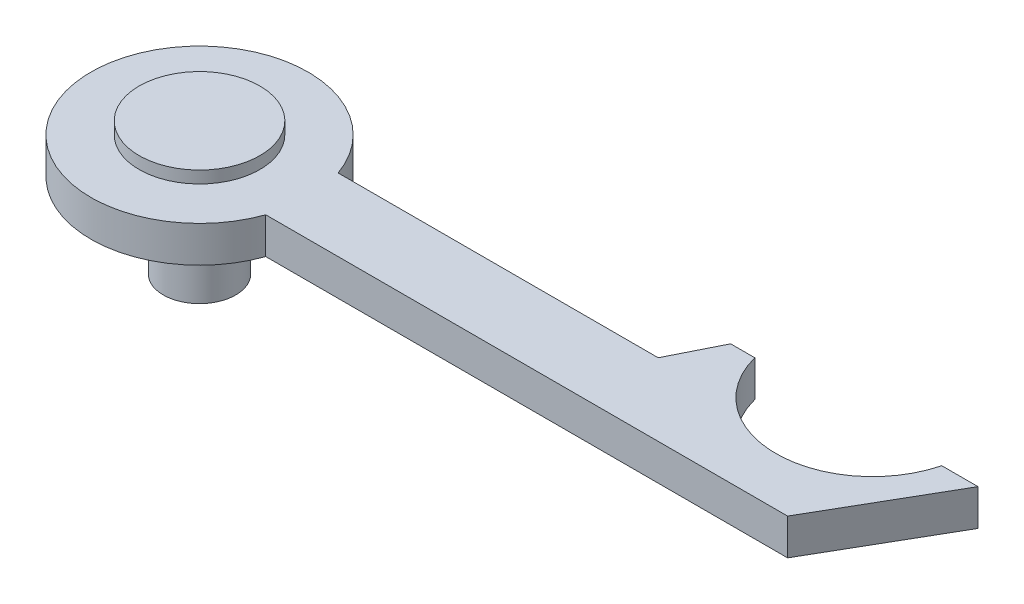
ISO-10303-21;
HEADER;
FILE_DESCRIPTION(('STEP AP214'),'2;1');
FILE_NAME('part.step','',(''),(''),'','','');
FILE_SCHEMA(('AUTOMOTIVE_DESIGN { 1 0 10303 214 1 1 1 1 }'));
ENDSEC;
DATA;
#1=APPLICATION_CONTEXT('core data for automotive mechanical design processes');
#2=APPLICATION_PROTOCOL_DEFINITION('international standard','automotive_design',2000,#1);
#3=PRODUCT_CONTEXT('',#1,'mechanical');
#4=PRODUCT('Part','Part','',(#3));
#5=PRODUCT_RELATED_PRODUCT_CATEGORY('part','',(#4));
#6=PRODUCT_DEFINITION_FORMATION('','',#4);
#7=PRODUCT_DEFINITION_CONTEXT('part definition',#1,'design');
#8=PRODUCT_DEFINITION('design','',#6,#7);
#9=PRODUCT_DEFINITION_SHAPE('','',#8);
#10=(LENGTH_UNIT() NAMED_UNIT(*) SI_UNIT(.MILLI.,.METRE.));
#11=(NAMED_UNIT(*) PLANE_ANGLE_UNIT() SI_UNIT($,.RADIAN.));
#12=(NAMED_UNIT(*) SI_UNIT($,.STERADIAN.) SOLID_ANGLE_UNIT());
#13=UNCERTAINTY_MEASURE_WITH_UNIT(LENGTH_MEASURE(1.E-05),#10,'distance_accuracy_value','');
#14=(GEOMETRIC_REPRESENTATION_CONTEXT(3) GLOBAL_UNCERTAINTY_ASSIGNED_CONTEXT((#13)) GLOBAL_UNIT_ASSIGNED_CONTEXT((#10,
#11,#12)) REPRESENTATION_CONTEXT('',''));
#15=CARTESIAN_POINT('',(0.,0.,0.));
#16=DIRECTION('',(0.,0.,1.));
#17=DIRECTION('',(1.,0.,0.));
#18=AXIS2_PLACEMENT_3D('',#15,#16,#17);
#19=CARTESIAN_POINT('',(0.,4.,0.));
#20=DIRECTION('',(0.,-1.,0.));
#21=DIRECTION('',(1.,0.,0.));
#22=AXIS2_PLACEMENT_3D('',#19,#20,#21);
#23=PLANE('',#22);
#24=CARTESIAN_POINT('',(0.,4.,0.));
#25=DIRECTION('',(0.,1.,0.));
#26=DIRECTION('',(-1.,0.,0.));
#27=AXIS2_PLACEMENT_3D('',#24,#25,#26);
#28=CIRCLE('',#27,5.);
#29=CARTESIAN_POINT('',(-5.,4.,0.));
#30=VERTEX_POINT('',#29);
#31=EDGE_CURVE('E11',#30,#30,#28,.T.);
#32=ORIENTED_EDGE('',*,*,#31,.T.);
#33=EDGE_LOOP('',(#32));
#34=FACE_BOUND('',#33,.T.);
#35=ADVANCED_FACE('F44',(#34),#23,.F.);
#36=CARTESIAN_POINT('',(0.,3.,0.));
#37=DIRECTION('',(0.,1.,0.));
#38=DIRECTION('',(-1.,0.,0.));
#39=AXIS2_PLACEMENT_3D('',#36,#37,#38);
#40=CYLINDRICAL_SURFACE('',#39,5.);
#41=ORIENTED_EDGE('',*,*,#31,.F.);
#42=EDGE_LOOP('',(#41));
#43=FACE_BOUND('',#42,.T.);
#44=CARTESIAN_POINT('',(0.,3.,0.));
#45=DIRECTION('',(0.,1.,0.));
#46=DIRECTION('',(-1.,0.,0.));
#47=AXIS2_PLACEMENT_3D('',#44,#45,#46);
#48=CIRCLE('',#47,5.);
#49=CARTESIAN_POINT('',(-5.,3.,0.));
#50=VERTEX_POINT('',#49);
#51=EDGE_CURVE('E50',#50,#50,#48,.T.);
#52=ORIENTED_EDGE('',*,*,#51,.T.);
#53=EDGE_LOOP('',(#52));
#54=FACE_BOUND('',#53,.T.);
#55=ADVANCED_FACE('F76',(#43,#54),#40,.T.);
#56=CARTESIAN_POINT('',(5.,3.,0.));
#57=DIRECTION('',(0.,1.,0.));
#58=DIRECTION('',(-1.,0.,0.));
#59=AXIS2_PLACEMENT_3D('',#56,#57,#58);
#60=PLANE('',#59);
#61=ORIENTED_EDGE('',*,*,#51,.F.);
#62=EDGE_LOOP('',(#61));
#63=FACE_BOUND('',#62,.T.);
#64=CARTESIAN_POINT('',(0.,3.,0.));
#65=DIRECTION('',(0.,1.,0.));
#66=DIRECTION('',(-1.,0.,0.));
#67=AXIS2_PLACEMENT_3D('',#64,#65,#66);
#68=CIRCLE('',#67,3.);
#69=CARTESIAN_POINT('',(-3.,3.,0.));
#70=VERTEX_POINT('',#69);
#71=EDGE_CURVE('E54',#70,#70,#68,.T.);
#72=ORIENTED_EDGE('',*,*,#71,.T.);
#73=EDGE_LOOP('',(#72));
#74=FACE_BOUND('',#73,.T.);
#75=ADVANCED_FACE('F72',(#63,#74),#60,.F.);
#76=CARTESIAN_POINT('',(0.,3.,0.));
#77=DIRECTION('',(0.,1.,0.));
#78=DIRECTION('',(-1.,0.,0.));
#79=AXIS2_PLACEMENT_3D('',#76,#77,#78);
#80=CYLINDRICAL_SURFACE('',#79,3.);
#81=ORIENTED_EDGE('',*,*,#71,.F.);
#82=EDGE_LOOP('',(#81));
#83=FACE_BOUND('',#82,.T.);
#84=CARTESIAN_POINT('',(0.,-7.,0.));
#85=DIRECTION('',(0.,1.,0.));
#86=DIRECTION('',(-1.,0.,0.));
#87=AXIS2_PLACEMENT_3D('',#84,#85,#86);
#88=CIRCLE('',#87,3.);
#89=CARTESIAN_POINT('',(-3.,-7.,0.));
#90=VERTEX_POINT('',#89);
#91=EDGE_CURVE('E58',#90,#90,#88,.T.);
#92=ORIENTED_EDGE('',*,*,#91,.T.);
#93=EDGE_LOOP('',(#92));
#94=FACE_BOUND('',#93,.T.);
#95=ADVANCED_FACE('F64',(#83,#94),#80,.T.);
#96=CARTESIAN_POINT('',(3.,-7.,0.));
#97=DIRECTION('',(0.,1.,0.));
#98=DIRECTION('',(-1.,0.,0.));
#99=AXIS2_PLACEMENT_3D('',#96,#97,#98);
#100=PLANE('',#99);
#101=ORIENTED_EDGE('',*,*,#91,.F.);
#102=EDGE_LOOP('',(#101));
#103=FACE_BOUND('',#102,.T.);
#104=ADVANCED_FACE('F66',(#103),#100,.F.);
#105=CLOSED_SHELL('',(#35,#55,#75,#95,#104));
#106=MANIFOLD_SOLID_BREP('B2',#105);
#107=CARTESIAN_POINT('',(0.,3.,0.));
#108=DIRECTION('',(0.,1.,0.));
#109=DIRECTION('',(0.,0.,1.));
#110=AXIS2_PLACEMENT_3D('',#107,#108,#109);
#111=PLANE('',#110);
#112=CARTESIAN_POINT('',(0.,3.,0.));
#113=DIRECTION('',(0.,1.,0.));
#114=DIRECTION('',(0.,0.,1.));
#115=AXIS2_PLACEMENT_3D('',#112,#113,#114);
#116=CIRCLE('',#115,9.);
#117=CARTESIAN_POINT('',(8.48528137423857,3.,-3.));
#118=VERTEX_POINT('',#117);
#119=CARTESIAN_POINT('',(8.48528137423857,3.,3.));
#120=VERTEX_POINT('',#119);
#121=EDGE_CURVE('E42',#118,#120,#116,.T.);
#122=ORIENTED_EDGE('',*,*,#121,.T.);
#123=DIRECTION('',(1.,0.,0.));
#124=VECTOR('',#123,1.);
#125=CARTESIAN_POINT('',(51.7184306929335,3.,3.));
#126=LINE('',#125,#124);
#127=CARTESIAN_POINT('',(51.7184306929335,3.,3.));
#128=VERTEX_POINT('',#127);
#129=EDGE_CURVE('E214',#120,#128,#126,.T.);
#130=ORIENTED_EDGE('',*,*,#129,.T.);
#131=DIRECTION('',(0.499999999999998,0.,-0.86602540378444));
#132=VECTOR('',#131,1.);
#133=CARTESIAN_POINT('',(57.4919333848297,3.,-7.));
#134=LINE('',#133,#132);
#135=CARTESIAN_POINT('',(57.4919333848297,3.,-7.));
#136=VERTEX_POINT('',#135);
#137=EDGE_CURVE('E217',#128,#136,#134,.T.);
#138=ORIENTED_EDGE('',*,*,#137,.T.);
#139=DIRECTION('',(-1.,0.,0.));
#140=VECTOR('',#139,1.);
#141=CARTESIAN_POINT('',(54.4919333848297,3.,-7.));
#142=LINE('',#141,#140);
#143=CARTESIAN_POINT('',(54.4919333848297,3.,-7.));
#144=VERTEX_POINT('',#143);
#145=EDGE_CURVE('E220',#136,#144,#142,.T.);
#146=ORIENTED_EDGE('',*,*,#145,.T.);
#147=CARTESIAN_POINT('',(46.7459666924148,3.,-9.));
#148=DIRECTION('',(0.,-1.,0.));
#149=DIRECTION('',(0.,0.,1.));
#150=AXIS2_PLACEMENT_3D('',#147,#148,#149);
#151=CIRCLE('',#150,8.);
#152=CARTESIAN_POINT('',(39.,3.,-7.));
#153=VERTEX_POINT('',#152);
#154=EDGE_CURVE('E223',#144,#153,#151,.T.);
#155=ORIENTED_EDGE('',*,*,#154,.T.);
#156=DIRECTION('',(-1.,0.,0.));
#157=VECTOR('',#156,1.);
#158=CARTESIAN_POINT('',(37.,3.,-7.));
#159=LINE('',#158,#157);
#160=CARTESIAN_POINT('',(37.,3.,-7.));
#161=VERTEX_POINT('',#160);
#162=EDGE_CURVE('E226',#153,#161,#159,.T.);
#163=ORIENTED_EDGE('',*,*,#162,.T.);
#164=DIRECTION('',(-0.447213595499958,0.,0.894427190999916));
#165=VECTOR('',#164,1.);
#166=CARTESIAN_POINT('',(35.,3.,-3.));
#167=LINE('',#166,#165);
#168=CARTESIAN_POINT('',(35.,3.,-3.));
#169=VERTEX_POINT('',#168);
#170=EDGE_CURVE('E190',#161,#169,#167,.T.);
#171=ORIENTED_EDGE('',*,*,#170,.T.);
#172=DIRECTION('',(-1.,0.,0.));
#173=VECTOR('',#172,1.);
#174=CARTESIAN_POINT('',(8.48528137423857,3.,-3.));
#175=LINE('',#174,#173);
#176=EDGE_CURVE('E128',#169,#118,#175,.T.);
#177=ORIENTED_EDGE('',*,*,#176,.T.);
#178=EDGE_LOOP('',(#122,#130,#138,#146,#155,#163,#171,#177));
#179=FACE_BOUND('',#178,.T.);
#180=CARTESIAN_POINT('',(0.,3.,0.));
#181=DIRECTION('',(0.,1.,0.));
#182=DIRECTION('',(0.,0.,1.));
#183=AXIS2_PLACEMENT_3D('',#180,#181,#182);
#184=CIRCLE('',#183,3.);
#185=CARTESIAN_POINT('',(0.,3.,3.));
#186=VERTEX_POINT('',#185);
#187=EDGE_CURVE('E243',#186,#186,#184,.T.);
#188=ORIENTED_EDGE('',*,*,#187,.F.);
#189=EDGE_LOOP('',(#188));
#190=FACE_BOUND('',#189,.T.);
#191=ADVANCED_FACE('F114',(#179,#190),#111,.T.);
#192=CARTESIAN_POINT('',(0.,0.,0.));
#193=DIRECTION('',(0.,1.,0.));
#194=DIRECTION('',(0.,0.,1.));
#195=AXIS2_PLACEMENT_3D('',#192,#193,#194);
#196=PLANE('',#195);
#197=CARTESIAN_POINT('',(0.,0.,0.));
#198=DIRECTION('',(0.,1.,0.));
#199=DIRECTION('',(0.,0.,1.));
#200=AXIS2_PLACEMENT_3D('',#197,#198,#199);
#201=CIRCLE('',#200,9.);
#202=CARTESIAN_POINT('',(8.48528137423857,0.,-3.));
#203=VERTEX_POINT('',#202);
#204=CARTESIAN_POINT('',(8.48528137423857,0.,3.));
#205=VERTEX_POINT('',#204);
#206=EDGE_CURVE('E118',#203,#205,#201,.T.);
#207=ORIENTED_EDGE('',*,*,#206,.F.);
#208=DIRECTION('',(-1.,0.,0.));
#209=VECTOR('',#208,1.);
#210=CARTESIAN_POINT('',(8.48528137423857,0.,-3.));
#211=LINE('',#210,#209);
#212=CARTESIAN_POINT('',(35.,0.,-3.));
#213=VERTEX_POINT('',#212);
#214=EDGE_CURVE('E136',#213,#203,#211,.T.);
#215=ORIENTED_EDGE('',*,*,#214,.F.);
#216=DIRECTION('',(-0.447213595499958,0.,0.894427190999916));
#217=VECTOR('',#216,1.);
#218=CARTESIAN_POINT('',(35.,0.,-3.));
#219=LINE('',#218,#217);
#220=CARTESIAN_POINT('',(37.,0.,-7.));
#221=VERTEX_POINT('',#220);
#222=EDGE_CURVE('E189',#221,#213,#219,.T.);
#223=ORIENTED_EDGE('',*,*,#222,.F.);
#224=DIRECTION('',(-1.,0.,0.));
#225=VECTOR('',#224,1.);
#226=CARTESIAN_POINT('',(37.,0.,-7.));
#227=LINE('',#226,#225);
#228=CARTESIAN_POINT('',(39.,0.,-7.));
#229=VERTEX_POINT('',#228);
#230=EDGE_CURVE('E203',#229,#221,#227,.T.);
#231=ORIENTED_EDGE('',*,*,#230,.F.);
#232=CARTESIAN_POINT('',(46.7459666924148,0.,-9.));
#233=DIRECTION('',(0.,-1.,0.));
#234=DIRECTION('',(0.,0.,1.));
#235=AXIS2_PLACEMENT_3D('',#232,#233,#234);
#236=CIRCLE('',#235,8.);
#237=CARTESIAN_POINT('',(54.4919333848297,0.,-7.));
#238=VERTEX_POINT('',#237);
#239=EDGE_CURVE('E207',#238,#229,#236,.T.);
#240=ORIENTED_EDGE('',*,*,#239,.F.);
#241=DIRECTION('',(-1.,0.,0.));
#242=VECTOR('',#241,1.);
#243=CARTESIAN_POINT('',(54.4919333848297,0.,-7.));
#244=LINE('',#243,#242);
#245=CARTESIAN_POINT('',(57.4919333848297,0.,-7.));
#246=VERTEX_POINT('',#245);
#247=EDGE_CURVE('E209',#246,#238,#244,.T.);
#248=ORIENTED_EDGE('',*,*,#247,.F.);
#249=DIRECTION('',(0.499999999999998,0.,-0.86602540378444));
#250=VECTOR('',#249,1.);
#251=CARTESIAN_POINT('',(57.4919333848297,0.,-7.));
#252=LINE('',#251,#250);
#253=CARTESIAN_POINT('',(51.7184306929335,0.,3.));
#254=VERTEX_POINT('',#253);
#255=EDGE_CURVE('E273',#254,#246,#252,.T.);
#256=ORIENTED_EDGE('',*,*,#255,.F.);
#257=DIRECTION('',(1.,0.,0.));
#258=VECTOR('',#257,1.);
#259=CARTESIAN_POINT('',(51.7184306929335,0.,3.));
#260=LINE('',#259,#258);
#261=EDGE_CURVE('E230',#205,#254,#260,.T.);
#262=ORIENTED_EDGE('',*,*,#261,.F.);
#263=EDGE_LOOP('',(#207,#215,#223,#231,#240,#248,#256,#262));
#264=FACE_BOUND('',#263,.T.);
#265=CARTESIAN_POINT('',(0.,0.,0.));
#266=DIRECTION('',(0.,1.,0.));
#267=DIRECTION('',(0.,0.,1.));
#268=AXIS2_PLACEMENT_3D('',#265,#266,#267);
#269=CIRCLE('',#268,3.);
#270=CARTESIAN_POINT('',(0.,0.,3.));
#271=VERTEX_POINT('',#270);
#272=EDGE_CURVE('E233',#271,#271,#269,.T.);
#273=ORIENTED_EDGE('',*,*,#272,.T.);
#274=EDGE_LOOP('',(#273));
#275=FACE_BOUND('',#274,.T.);
#276=ADVANCED_FACE('F200',(#264,#275),#196,.F.);
#277=CARTESIAN_POINT('',(0.,3.,0.));
#278=DIRECTION('',(0.,-1.,0.));
#279=DIRECTION('',(0.,0.,-1.));
#280=AXIS2_PLACEMENT_3D('',#277,#278,#279);
#281=CYLINDRICAL_SURFACE('',#280,9.);
#282=ORIENTED_EDGE('',*,*,#121,.F.);
#283=DIRECTION('',(0.,1.,0.));
#284=VECTOR('',#283,1.);
#285=CARTESIAN_POINT('',(8.48528137423857,0.,-3.));
#286=LINE('',#285,#284);
#287=EDGE_CURVE('E231',#203,#118,#286,.T.);
#288=ORIENTED_EDGE('',*,*,#287,.F.);
#289=ORIENTED_EDGE('',*,*,#206,.T.);
#290=DIRECTION('',(0.,1.,0.));
#291=VECTOR('',#290,1.);
#292=CARTESIAN_POINT('',(8.48528137423857,0.,3.));
#293=LINE('',#292,#291);
#294=EDGE_CURVE('E172',#205,#120,#293,.T.);
#295=ORIENTED_EDGE('',*,*,#294,.T.);
#296=EDGE_LOOP('',(#282,#288,#289,#295));
#297=FACE_BOUND('',#296,.T.);
#298=ADVANCED_FACE('F116',(#297),#281,.T.);
#299=CARTESIAN_POINT('',(0.,3.,0.));
#300=DIRECTION('',(0.,-1.,0.));
#301=DIRECTION('',(0.,0.,-1.));
#302=AXIS2_PLACEMENT_3D('',#299,#300,#301);
#303=CYLINDRICAL_SURFACE('',#302,3.);
#304=ORIENTED_EDGE('',*,*,#187,.T.);
#305=EDGE_LOOP('',(#304));
#306=FACE_BOUND('',#305,.T.);
#307=ORIENTED_EDGE('',*,*,#272,.F.);
#308=EDGE_LOOP('',(#307));
#309=FACE_BOUND('',#308,.T.);
#310=ADVANCED_FACE('F249',(#306,#309),#303,.F.);
#311=CARTESIAN_POINT('',(8.48528137423857,0.,-3.));
#312=DIRECTION('',(0.,0.,-1.));
#313=DIRECTION('',(-1.,0.,0.));
#314=AXIS2_PLACEMENT_3D('',#311,#312,#313);
#315=PLANE('',#314);
#316=ORIENTED_EDGE('',*,*,#176,.F.);
#317=DIRECTION('',(0.,1.,0.));
#318=VECTOR('',#317,1.);
#319=CARTESIAN_POINT('',(35.,0.,-3.));
#320=LINE('',#319,#318);
#321=EDGE_CURVE('E165',#213,#169,#320,.T.);
#322=ORIENTED_EDGE('',*,*,#321,.F.);
#323=ORIENTED_EDGE('',*,*,#214,.T.);
#324=ORIENTED_EDGE('',*,*,#287,.T.);
#325=EDGE_LOOP('',(#316,#322,#323,#324));
#326=FACE_BOUND('',#325,.T.);
#327=ADVANCED_FACE('F251',(#326),#315,.T.);
#328=CARTESIAN_POINT('',(35.,0.,-3.));
#329=DIRECTION('',(-0.894427190999916,0.,-0.447213595499958));
#330=DIRECTION('',(-0.447213595499958,0.,0.894427190999916));
#331=AXIS2_PLACEMENT_3D('',#328,#329,#330);
#332=PLANE('',#331);
#333=ORIENTED_EDGE('',*,*,#170,.F.);
#334=DIRECTION('',(0.,1.,0.));
#335=VECTOR('',#334,1.);
#336=CARTESIAN_POINT('',(37.,0.,-7.));
#337=LINE('',#336,#335);
#338=EDGE_CURVE('E186',#221,#161,#337,.T.);
#339=ORIENTED_EDGE('',*,*,#338,.F.);
#340=ORIENTED_EDGE('',*,*,#222,.T.);
#341=ORIENTED_EDGE('',*,*,#321,.T.);
#342=EDGE_LOOP('',(#333,#339,#340,#341));
#343=FACE_BOUND('',#342,.T.);
#344=ADVANCED_FACE('F188',(#343),#332,.T.);
#345=CARTESIAN_POINT('',(37.,0.,-7.));
#346=DIRECTION('',(0.,0.,-1.));
#347=DIRECTION('',(-1.,0.,0.));
#348=AXIS2_PLACEMENT_3D('',#345,#346,#347);
#349=PLANE('',#348);
#350=ORIENTED_EDGE('',*,*,#162,.F.);
#351=DIRECTION('',(0.,1.,0.));
#352=VECTOR('',#351,1.);
#353=CARTESIAN_POINT('',(39.,0.,-7.));
#354=LINE('',#353,#352);
#355=EDGE_CURVE('E195',#229,#153,#354,.T.);
#356=ORIENTED_EDGE('',*,*,#355,.F.);
#357=ORIENTED_EDGE('',*,*,#230,.T.);
#358=ORIENTED_EDGE('',*,*,#338,.T.);
#359=EDGE_LOOP('',(#350,#356,#357,#358));
#360=FACE_BOUND('',#359,.T.);
#361=ADVANCED_FACE('F206',(#360),#349,.T.);
#362=CARTESIAN_POINT('',(46.7459666924148,0.,-9.));
#363=DIRECTION('',(0.,1.,0.));
#364=DIRECTION('',(0.,0.,1.));
#365=AXIS2_PLACEMENT_3D('',#362,#363,#364);
#366=CYLINDRICAL_SURFACE('',#365,8.);
#367=ORIENTED_EDGE('',*,*,#154,.F.);
#368=DIRECTION('',(0.,1.,0.));
#369=VECTOR('',#368,1.);
#370=CARTESIAN_POINT('',(54.4919333848297,0.,-7.));
#371=LINE('',#370,#369);
#372=EDGE_CURVE('E236',#238,#144,#371,.T.);
#373=ORIENTED_EDGE('',*,*,#372,.F.);
#374=ORIENTED_EDGE('',*,*,#239,.T.);
#375=ORIENTED_EDGE('',*,*,#355,.T.);
#376=EDGE_LOOP('',(#367,#373,#374,#375));
#377=FACE_BOUND('',#376,.T.);
#378=ADVANCED_FACE('F293',(#377),#366,.F.);
#379=CARTESIAN_POINT('',(54.4919333848297,0.,-7.));
#380=DIRECTION('',(0.,0.,-1.));
#381=DIRECTION('',(-1.,0.,0.));
#382=AXIS2_PLACEMENT_3D('',#379,#380,#381);
#383=PLANE('',#382);
#384=ORIENTED_EDGE('',*,*,#145,.F.);
#385=DIRECTION('',(0.,1.,0.));
#386=VECTOR('',#385,1.);
#387=CARTESIAN_POINT('',(57.4919333848297,0.,-7.));
#388=LINE('',#387,#386);
#389=EDGE_CURVE('E238',#246,#136,#388,.T.);
#390=ORIENTED_EDGE('',*,*,#389,.F.);
#391=ORIENTED_EDGE('',*,*,#247,.T.);
#392=ORIENTED_EDGE('',*,*,#372,.T.);
#393=EDGE_LOOP('',(#384,#390,#391,#392));
#394=FACE_BOUND('',#393,.T.);
#395=ADVANCED_FACE('F279',(#394),#383,.T.);
#396=CARTESIAN_POINT('',(57.4919333848297,0.,-7.));
#397=DIRECTION('',(0.86602540378444,0.,0.499999999999998));
#398=DIRECTION('',(0.499999999999998,0.,-0.86602540378444));
#399=AXIS2_PLACEMENT_3D('',#396,#397,#398);
#400=PLANE('',#399);
#401=ORIENTED_EDGE('',*,*,#137,.F.);
#402=DIRECTION('',(0.,1.,0.));
#403=VECTOR('',#402,1.);
#404=CARTESIAN_POINT('',(51.7184306929335,0.,3.));
#405=LINE('',#404,#403);
#406=EDGE_CURVE('E240',#254,#128,#405,.T.);
#407=ORIENTED_EDGE('',*,*,#406,.F.);
#408=ORIENTED_EDGE('',*,*,#255,.T.);
#409=ORIENTED_EDGE('',*,*,#389,.T.);
#410=EDGE_LOOP('',(#401,#407,#408,#409));
#411=FACE_BOUND('',#410,.T.);
#412=ADVANCED_FACE('F283',(#411),#400,.T.);
#413=CARTESIAN_POINT('',(51.7184306929335,0.,3.));
#414=DIRECTION('',(0.,0.,1.));
#415=DIRECTION('',(1.,0.,0.));
#416=AXIS2_PLACEMENT_3D('',#413,#414,#415);
#417=PLANE('',#416);
#418=ORIENTED_EDGE('',*,*,#129,.F.);
#419=ORIENTED_EDGE('',*,*,#294,.F.);
#420=ORIENTED_EDGE('',*,*,#261,.T.);
#421=ORIENTED_EDGE('',*,*,#406,.T.);
#422=EDGE_LOOP('',(#418,#419,#420,#421));
#423=FACE_BOUND('',#422,.T.);
#424=ADVANCED_FACE('F284',(#423),#417,.T.);
#425=CLOSED_SHELL('',(#191,#276,#298,#310,#327,#344,#361,#378,#395,#412,#424));
#426=MANIFOLD_SOLID_BREP('B6',#425);
#427=ADVANCED_BREP_SHAPE_REPRESENTATION('',(#18,#106,#426),#14);
#428=SHAPE_DEFINITION_REPRESENTATION(#9,#427);
ENDSEC;
END-ISO-10303-21;
